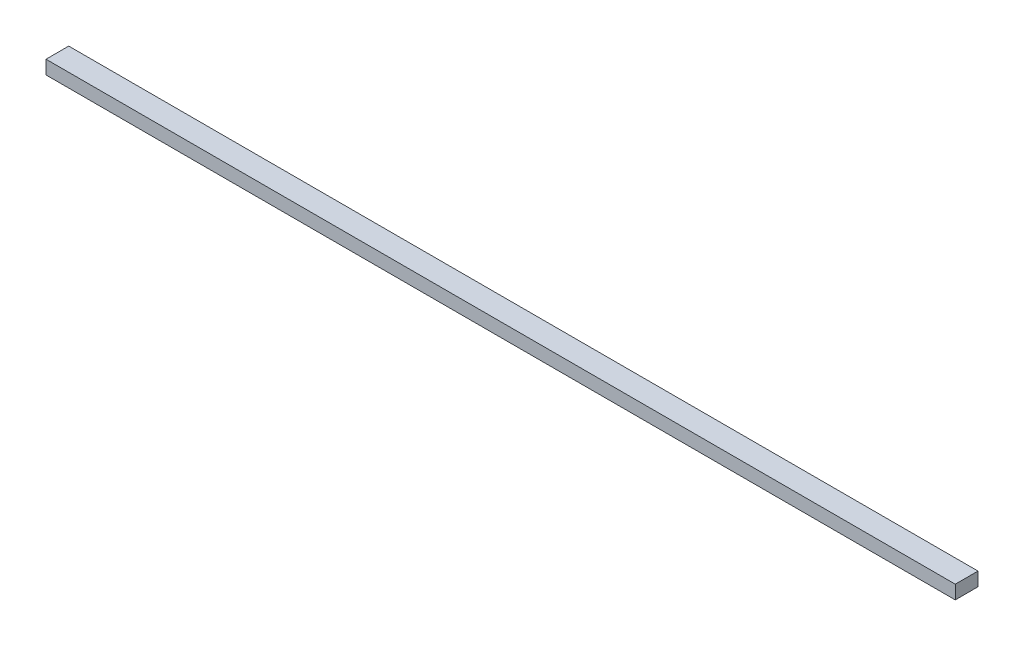
ISO-10303-21;
HEADER;
FILE_DESCRIPTION(('STEP AP214'),'2;1');
FILE_NAME('part.step','',(''),(''),'','','');
FILE_SCHEMA(('AUTOMOTIVE_DESIGN { 1 0 10303 214 1 1 1 1 }'));
ENDSEC;
DATA;
#1=APPLICATION_CONTEXT('core data for automotive mechanical design processes');
#2=APPLICATION_PROTOCOL_DEFINITION('international standard','automotive_design',2000,#1);
#3=PRODUCT_CONTEXT('',#1,'mechanical');
#4=PRODUCT('Part','Part','',(#3));
#5=PRODUCT_RELATED_PRODUCT_CATEGORY('part','',(#4));
#6=PRODUCT_DEFINITION_FORMATION('','',#4);
#7=PRODUCT_DEFINITION_CONTEXT('part definition',#1,'design');
#8=PRODUCT_DEFINITION('design','',#6,#7);
#9=PRODUCT_DEFINITION_SHAPE('','',#8);
#10=(LENGTH_UNIT() NAMED_UNIT(*) SI_UNIT(.MILLI.,.METRE.));
#11=(NAMED_UNIT(*) PLANE_ANGLE_UNIT() SI_UNIT($,.RADIAN.));
#12=(NAMED_UNIT(*) SI_UNIT($,.STERADIAN.) SOLID_ANGLE_UNIT());
#13=UNCERTAINTY_MEASURE_WITH_UNIT(LENGTH_MEASURE(1.E-05),#10,'distance_accuracy_value','');
#14=(GEOMETRIC_REPRESENTATION_CONTEXT(3) GLOBAL_UNCERTAINTY_ASSIGNED_CONTEXT((#13)) GLOBAL_UNIT_ASSIGNED_CONTEXT((#10,
#11,#12)) REPRESENTATION_CONTEXT('',''));
#15=CARTESIAN_POINT('',(0.,0.,0.));
#16=DIRECTION('',(0.,0.,1.));
#17=DIRECTION('',(1.,0.,0.));
#18=AXIS2_PLACEMENT_3D('',#15,#16,#17);
#19=CARTESIAN_POINT('',(0.,3.,0.));
#20=DIRECTION('',(1.,0.,0.));
#21=DIRECTION('',(0.,0.,-1.));
#22=AXIS2_PLACEMENT_3D('',#19,#20,#21);
#23=PLANE('',#22);
#24=DIRECTION('',(0.,0.,1.));
#25=VECTOR('',#24,1.);
#26=CARTESIAN_POINT('',(0.,0.,0.));
#27=LINE('',#26,#25);
#28=CARTESIAN_POINT('',(0.,0.,-5.));
#29=VERTEX_POINT('',#28);
#30=CARTESIAN_POINT('',(0.,0.,0.));
#31=VERTEX_POINT('',#30);
#32=EDGE_CURVE('E96',#29,#31,#27,.T.);
#33=ORIENTED_EDGE('',*,*,#32,.T.);
#34=DIRECTION('',(0.,-1.,0.));
#35=VECTOR('',#34,1.);
#36=CARTESIAN_POINT('',(0.,3.,0.));
#37=LINE('',#36,#35);
#38=CARTESIAN_POINT('',(0.,3.,0.));
#39=VERTEX_POINT('',#38);
#40=EDGE_CURVE('E11',#39,#31,#37,.T.);
#41=ORIENTED_EDGE('',*,*,#40,.F.);
#42=DIRECTION('',(0.,0.,1.));
#43=VECTOR('',#42,1.);
#44=CARTESIAN_POINT('',(0.,3.,0.));
#45=LINE('',#44,#43);
#46=CARTESIAN_POINT('',(0.,3.,-5.));
#47=VERTEX_POINT('',#46);
#48=EDGE_CURVE('E84',#47,#39,#45,.T.);
#49=ORIENTED_EDGE('',*,*,#48,.F.);
#50=DIRECTION('',(0.,-1.,0.));
#51=VECTOR('',#50,1.);
#52=CARTESIAN_POINT('',(0.,3.,-5.));
#53=LINE('',#52,#51);
#54=EDGE_CURVE('E92',#47,#29,#53,.T.);
#55=ORIENTED_EDGE('',*,*,#54,.T.);
#56=EDGE_LOOP('',(#33,#41,#49,#55));
#57=FACE_BOUND('',#56,.T.);
#58=ADVANCED_FACE('F33',(#57),#23,.F.);
#59=CARTESIAN_POINT('',(0.,3.,0.));
#60=DIRECTION('',(0.,0.,-1.));
#61=DIRECTION('',(-1.,0.,0.));
#62=AXIS2_PLACEMENT_3D('',#59,#60,#61);
#63=PLANE('',#62);
#64=DIRECTION('',(1.,0.,0.));
#65=VECTOR('',#64,1.);
#66=CARTESIAN_POINT('',(0.,0.,0.));
#67=LINE('',#66,#65);
#68=CARTESIAN_POINT('',(200.,0.,0.));
#69=VERTEX_POINT('',#68);
#70=EDGE_CURVE('E88',#31,#69,#67,.T.);
#71=ORIENTED_EDGE('',*,*,#70,.T.);
#72=DIRECTION('',(0.,-1.,0.));
#73=VECTOR('',#72,1.);
#74=CARTESIAN_POINT('',(200.,3.,0.));
#75=LINE('',#74,#73);
#76=CARTESIAN_POINT('',(200.,3.,0.));
#77=VERTEX_POINT('',#76);
#78=EDGE_CURVE('E41',#77,#69,#75,.T.);
#79=ORIENTED_EDGE('',*,*,#78,.F.);
#80=DIRECTION('',(1.,0.,0.));
#81=VECTOR('',#80,1.);
#82=CARTESIAN_POINT('',(0.,3.,0.));
#83=LINE('',#82,#81);
#84=EDGE_CURVE('E79',#39,#77,#83,.T.);
#85=ORIENTED_EDGE('',*,*,#84,.F.);
#86=ORIENTED_EDGE('',*,*,#40,.T.);
#87=EDGE_LOOP('',(#71,#79,#85,#86));
#88=FACE_BOUND('',#87,.T.);
#89=ADVANCED_FACE('F87',(#88),#63,.F.);
#90=CARTESIAN_POINT('',(200.,3.,0.));
#91=DIRECTION('',(-1.,0.,0.));
#92=DIRECTION('',(0.,0.,1.));
#93=AXIS2_PLACEMENT_3D('',#90,#91,#92);
#94=PLANE('',#93);
#95=DIRECTION('',(0.,0.,-1.));
#96=VECTOR('',#95,1.);
#97=CARTESIAN_POINT('',(200.,0.,0.));
#98=LINE('',#97,#96);
#99=CARTESIAN_POINT('',(200.,0.,-5.));
#100=VERTEX_POINT('',#99);
#101=EDGE_CURVE('E66',#69,#100,#98,.T.);
#102=ORIENTED_EDGE('',*,*,#101,.T.);
#103=DIRECTION('',(0.,-1.,0.));
#104=VECTOR('',#103,1.);
#105=CARTESIAN_POINT('',(200.,3.,-5.));
#106=LINE('',#105,#104);
#107=CARTESIAN_POINT('',(200.,3.,-5.));
#108=VERTEX_POINT('',#107);
#109=EDGE_CURVE('E89',#108,#100,#106,.T.);
#110=ORIENTED_EDGE('',*,*,#109,.F.);
#111=DIRECTION('',(0.,0.,-1.));
#112=VECTOR('',#111,1.);
#113=CARTESIAN_POINT('',(200.,3.,0.));
#114=LINE('',#113,#112);
#115=EDGE_CURVE('E82',#77,#108,#114,.T.);
#116=ORIENTED_EDGE('',*,*,#115,.F.);
#117=ORIENTED_EDGE('',*,*,#78,.T.);
#118=EDGE_LOOP('',(#102,#110,#116,#117));
#119=FACE_BOUND('',#118,.T.);
#120=ADVANCED_FACE('F90',(#119),#94,.F.);
#121=CARTESIAN_POINT('',(0.,3.,-5.));
#122=DIRECTION('',(0.,0.,1.));
#123=DIRECTION('',(1.,0.,0.));
#124=AXIS2_PLACEMENT_3D('',#121,#122,#123);
#125=PLANE('',#124);
#126=DIRECTION('',(-1.,0.,0.));
#127=VECTOR('',#126,1.);
#128=CARTESIAN_POINT('',(0.,0.,-5.));
#129=LINE('',#128,#127);
#130=EDGE_CURVE('E72',#100,#29,#129,.T.);
#131=ORIENTED_EDGE('',*,*,#130,.T.);
#132=ORIENTED_EDGE('',*,*,#54,.F.);
#133=DIRECTION('',(-1.,0.,0.));
#134=VECTOR('',#133,1.);
#135=CARTESIAN_POINT('',(0.,3.,-5.));
#136=LINE('',#135,#134);
#137=EDGE_CURVE('E49',#108,#47,#136,.T.);
#138=ORIENTED_EDGE('',*,*,#137,.F.);
#139=ORIENTED_EDGE('',*,*,#109,.T.);
#140=EDGE_LOOP('',(#131,#132,#138,#139));
#141=FACE_BOUND('',#140,.T.);
#142=ADVANCED_FACE('F103',(#141),#125,.F.);
#143=CARTESIAN_POINT('',(0.,3.,0.));
#144=DIRECTION('',(0.,-1.,0.));
#145=DIRECTION('',(0.,0.,-1.));
#146=AXIS2_PLACEMENT_3D('',#143,#144,#145);
#147=PLANE('',#146);
#148=ORIENTED_EDGE('',*,*,#48,.T.);
#149=ORIENTED_EDGE('',*,*,#84,.T.);
#150=ORIENTED_EDGE('',*,*,#115,.T.);
#151=ORIENTED_EDGE('',*,*,#137,.T.);
#152=EDGE_LOOP('',(#148,#149,#150,#151));
#153=FACE_BOUND('',#152,.T.);
#154=ADVANCED_FACE('F80',(#153),#147,.F.);
#155=CARTESIAN_POINT('',(0.,0.,0.));
#156=DIRECTION('',(0.,-1.,0.));
#157=DIRECTION('',(0.,0.,-1.));
#158=AXIS2_PLACEMENT_3D('',#155,#156,#157);
#159=PLANE('',#158);
#160=ORIENTED_EDGE('',*,*,#32,.F.);
#161=ORIENTED_EDGE('',*,*,#130,.F.);
#162=ORIENTED_EDGE('',*,*,#101,.F.);
#163=ORIENTED_EDGE('',*,*,#70,.F.);
#164=EDGE_LOOP('',(#160,#161,#162,#163));
#165=FACE_BOUND('',#164,.T.);
#166=ADVANCED_FACE('F106',(#165),#159,.T.);
#167=CLOSED_SHELL('',(#58,#89,#120,#142,#154,#166));
#168=MANIFOLD_SOLID_BREP('B2',#167);
#169=ADVANCED_BREP_SHAPE_REPRESENTATION('',(#18,#168),#14);
#170=SHAPE_DEFINITION_REPRESENTATION(#9,#169);
ENDSEC;
END-ISO-10303-21;
